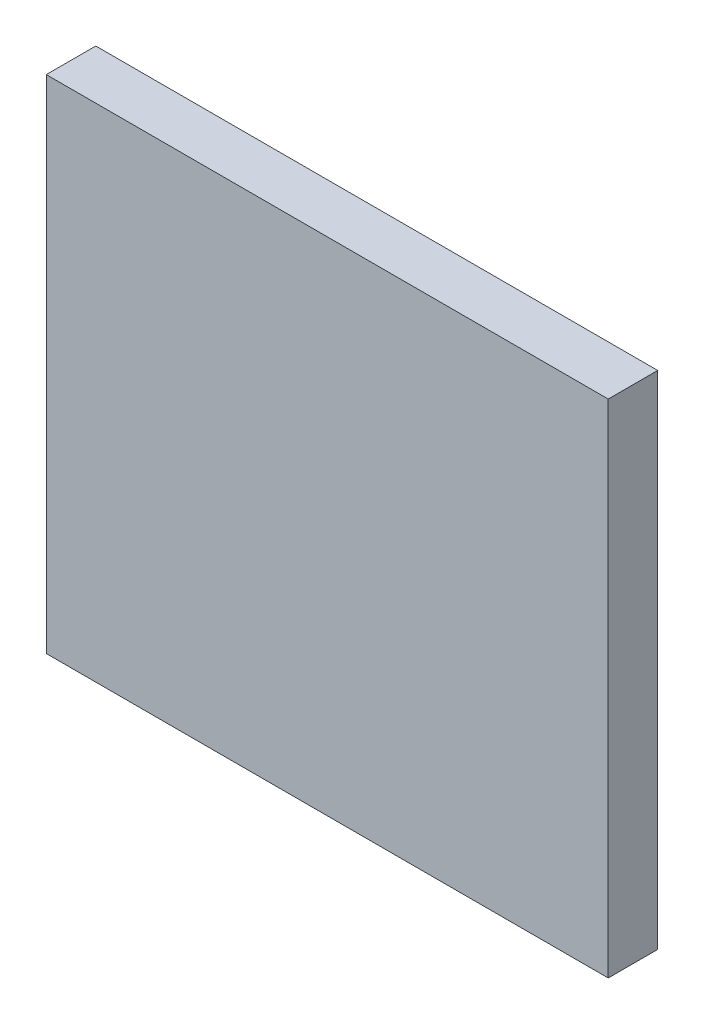
ISO-10303-21;
HEADER;
FILE_DESCRIPTION(('STEP AP214'),'2;1');
FILE_NAME('part.step','',(''),(''),'','','');
FILE_SCHEMA(('AUTOMOTIVE_DESIGN { 1 0 10303 214 1 1 1 1 }'));
ENDSEC;
DATA;
#1=APPLICATION_CONTEXT('core data for automotive mechanical design processes');
#2=APPLICATION_PROTOCOL_DEFINITION('international standard','automotive_design',2000,#1);
#3=PRODUCT_CONTEXT('',#1,'mechanical');
#4=PRODUCT('Part','Part','',(#3));
#5=PRODUCT_RELATED_PRODUCT_CATEGORY('part','',(#4));
#6=PRODUCT_DEFINITION_FORMATION('','',#4);
#7=PRODUCT_DEFINITION_CONTEXT('part definition',#1,'design');
#8=PRODUCT_DEFINITION('design','',#6,#7);
#9=PRODUCT_DEFINITION_SHAPE('','',#8);
#10=(LENGTH_UNIT() NAMED_UNIT(*) SI_UNIT(.MILLI.,.METRE.));
#11=(NAMED_UNIT(*) PLANE_ANGLE_UNIT() SI_UNIT($,.RADIAN.));
#12=(NAMED_UNIT(*) SI_UNIT($,.STERADIAN.) SOLID_ANGLE_UNIT());
#13=UNCERTAINTY_MEASURE_WITH_UNIT(LENGTH_MEASURE(1.E-05),#10,'distance_accuracy_value','');
#14=(GEOMETRIC_REPRESENTATION_CONTEXT(3) GLOBAL_UNCERTAINTY_ASSIGNED_CONTEXT((#13)) GLOBAL_UNIT_ASSIGNED_CONTEXT((#10,
#11,#12)) REPRESENTATION_CONTEXT('',''));
#15=CARTESIAN_POINT('',(0.,0.,0.));
#16=DIRECTION('',(0.,0.,1.));
#17=DIRECTION('',(1.,0.,0.));
#18=AXIS2_PLACEMENT_3D('',#15,#16,#17);
#19=CARTESIAN_POINT('',(-6.35,-8.8135,1.));
#20=DIRECTION('',(1.,0.,0.));
#21=DIRECTION('',(0.,0.,-1.));
#22=AXIS2_PLACEMENT_3D('',#19,#20,#21);
#23=PLANE('',#22);
#24=DIRECTION('',(0.,-1.,0.));
#25=VECTOR('',#24,1.);
#26=CARTESIAN_POINT('',(-6.35,-8.8135,0.));
#27=LINE('',#26,#25);
#28=CARTESIAN_POINT('',(-6.35,1.3135,0.));
#29=VERTEX_POINT('',#28);
#30=CARTESIAN_POINT('',(-6.35,-8.8135,0.));
#31=VERTEX_POINT('',#30);
#32=EDGE_CURVE('E96',#29,#31,#27,.T.);
#33=ORIENTED_EDGE('',*,*,#32,.T.);
#34=DIRECTION('',(0.,0.,-1.));
#35=VECTOR('',#34,1.);
#36=CARTESIAN_POINT('',(-6.35,-8.8135,1.));
#37=LINE('',#36,#35);
#38=CARTESIAN_POINT('',(-6.35,-8.8135,1.));
#39=VERTEX_POINT('',#38);
#40=EDGE_CURVE('E11',#39,#31,#37,.T.);
#41=ORIENTED_EDGE('',*,*,#40,.F.);
#42=DIRECTION('',(0.,-1.,0.));
#43=VECTOR('',#42,1.);
#44=CARTESIAN_POINT('',(-6.35,-8.8135,1.));
#45=LINE('',#44,#43);
#46=CARTESIAN_POINT('',(-6.35,1.3135,1.));
#47=VERTEX_POINT('',#46);
#48=EDGE_CURVE('E84',#47,#39,#45,.T.);
#49=ORIENTED_EDGE('',*,*,#48,.F.);
#50=DIRECTION('',(0.,0.,-1.));
#51=VECTOR('',#50,1.);
#52=CARTESIAN_POINT('',(-6.35,1.3135,1.));
#53=LINE('',#52,#51);
#54=EDGE_CURVE('E92',#47,#29,#53,.T.);
#55=ORIENTED_EDGE('',*,*,#54,.T.);
#56=EDGE_LOOP('',(#33,#41,#49,#55));
#57=FACE_BOUND('',#56,.T.);
#58=ADVANCED_FACE('F33',(#57),#23,.F.);
#59=CARTESIAN_POINT('',(5.,-8.8135,1.));
#60=DIRECTION('',(0.,1.,0.));
#61=DIRECTION('',(0.,0.,1.));
#62=AXIS2_PLACEMENT_3D('',#59,#60,#61);
#63=PLANE('',#62);
#64=DIRECTION('',(1.,0.,0.));
#65=VECTOR('',#64,1.);
#66=CARTESIAN_POINT('',(5.,-8.8135,0.));
#67=LINE('',#66,#65);
#68=CARTESIAN_POINT('',(5.,-8.8135,0.));
#69=VERTEX_POINT('',#68);
#70=EDGE_CURVE('E88',#31,#69,#67,.T.);
#71=ORIENTED_EDGE('',*,*,#70,.T.);
#72=DIRECTION('',(0.,0.,-1.));
#73=VECTOR('',#72,1.);
#74=CARTESIAN_POINT('',(5.,-8.8135,1.));
#75=LINE('',#74,#73);
#76=CARTESIAN_POINT('',(5.,-8.8135,1.));
#77=VERTEX_POINT('',#76);
#78=EDGE_CURVE('E41',#77,#69,#75,.T.);
#79=ORIENTED_EDGE('',*,*,#78,.F.);
#80=DIRECTION('',(1.,0.,0.));
#81=VECTOR('',#80,1.);
#82=CARTESIAN_POINT('',(5.,-8.8135,1.));
#83=LINE('',#82,#81);
#84=EDGE_CURVE('E79',#39,#77,#83,.T.);
#85=ORIENTED_EDGE('',*,*,#84,.F.);
#86=ORIENTED_EDGE('',*,*,#40,.T.);
#87=EDGE_LOOP('',(#71,#79,#85,#86));
#88=FACE_BOUND('',#87,.T.);
#89=ADVANCED_FACE('F87',(#88),#63,.F.);
#90=CARTESIAN_POINT('',(5.,1.3135,1.));
#91=DIRECTION('',(-1.,0.,0.));
#92=DIRECTION('',(0.,0.,1.));
#93=AXIS2_PLACEMENT_3D('',#90,#91,#92);
#94=PLANE('',#93);
#95=DIRECTION('',(0.,1.,0.));
#96=VECTOR('',#95,1.);
#97=CARTESIAN_POINT('',(5.,1.3135,0.));
#98=LINE('',#97,#96);
#99=CARTESIAN_POINT('',(5.,1.3135,0.));
#100=VERTEX_POINT('',#99);
#101=EDGE_CURVE('E66',#69,#100,#98,.T.);
#102=ORIENTED_EDGE('',*,*,#101,.T.);
#103=DIRECTION('',(0.,0.,-1.));
#104=VECTOR('',#103,1.);
#105=CARTESIAN_POINT('',(5.,1.3135,1.));
#106=LINE('',#105,#104);
#107=CARTESIAN_POINT('',(5.,1.3135,1.));
#108=VERTEX_POINT('',#107);
#109=EDGE_CURVE('E89',#108,#100,#106,.T.);
#110=ORIENTED_EDGE('',*,*,#109,.F.);
#111=DIRECTION('',(0.,1.,0.));
#112=VECTOR('',#111,1.);
#113=CARTESIAN_POINT('',(5.,1.3135,1.));
#114=LINE('',#113,#112);
#115=EDGE_CURVE('E82',#77,#108,#114,.T.);
#116=ORIENTED_EDGE('',*,*,#115,.F.);
#117=ORIENTED_EDGE('',*,*,#78,.T.);
#118=EDGE_LOOP('',(#102,#110,#116,#117));
#119=FACE_BOUND('',#118,.T.);
#120=ADVANCED_FACE('F90',(#119),#94,.F.);
#121=CARTESIAN_POINT('',(-6.35,1.3135,1.));
#122=DIRECTION('',(0.,-1.,0.));
#123=DIRECTION('',(0.,0.,-1.));
#124=AXIS2_PLACEMENT_3D('',#121,#122,#123);
#125=PLANE('',#124);
#126=DIRECTION('',(-1.,0.,0.));
#127=VECTOR('',#126,1.);
#128=CARTESIAN_POINT('',(-6.35,1.3135,0.));
#129=LINE('',#128,#127);
#130=EDGE_CURVE('E72',#100,#29,#129,.T.);
#131=ORIENTED_EDGE('',*,*,#130,.T.);
#132=ORIENTED_EDGE('',*,*,#54,.F.);
#133=DIRECTION('',(-1.,0.,0.));
#134=VECTOR('',#133,1.);
#135=CARTESIAN_POINT('',(-6.35,1.3135,1.));
#136=LINE('',#135,#134);
#137=EDGE_CURVE('E49',#108,#47,#136,.T.);
#138=ORIENTED_EDGE('',*,*,#137,.F.);
#139=ORIENTED_EDGE('',*,*,#109,.T.);
#140=EDGE_LOOP('',(#131,#132,#138,#139));
#141=FACE_BOUND('',#140,.T.);
#142=ADVANCED_FACE('F103',(#141),#125,.F.);
#143=CARTESIAN_POINT('',(0.,0.,1.));
#144=DIRECTION('',(0.,0.,-1.));
#145=DIRECTION('',(-1.,0.,0.));
#146=AXIS2_PLACEMENT_3D('',#143,#144,#145);
#147=PLANE('',#146);
#148=ORIENTED_EDGE('',*,*,#48,.T.);
#149=ORIENTED_EDGE('',*,*,#84,.T.);
#150=ORIENTED_EDGE('',*,*,#115,.T.);
#151=ORIENTED_EDGE('',*,*,#137,.T.);
#152=EDGE_LOOP('',(#148,#149,#150,#151));
#153=FACE_BOUND('',#152,.T.);
#154=ADVANCED_FACE('F80',(#153),#147,.F.);
#155=CARTESIAN_POINT('',(0.,0.,0.));
#156=DIRECTION('',(0.,0.,-1.));
#157=DIRECTION('',(-1.,0.,0.));
#158=AXIS2_PLACEMENT_3D('',#155,#156,#157);
#159=PLANE('',#158);
#160=ORIENTED_EDGE('',*,*,#32,.F.);
#161=ORIENTED_EDGE('',*,*,#130,.F.);
#162=ORIENTED_EDGE('',*,*,#101,.F.);
#163=ORIENTED_EDGE('',*,*,#70,.F.);
#164=EDGE_LOOP('',(#160,#161,#162,#163));
#165=FACE_BOUND('',#164,.T.);
#166=ADVANCED_FACE('F106',(#165),#159,.T.);
#167=CLOSED_SHELL('',(#58,#89,#120,#142,#154,#166));
#168=MANIFOLD_SOLID_BREP('B2',#167);
#169=ADVANCED_BREP_SHAPE_REPRESENTATION('',(#18,#168),#14);
#170=SHAPE_DEFINITION_REPRESENTATION(#9,#169);
ENDSEC;
END-ISO-10303-21;
